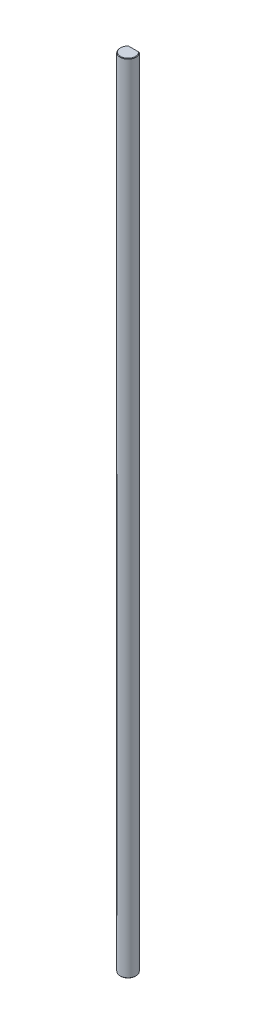
ISO-10303-21;
HEADER;
FILE_DESCRIPTION(('STEP AP214'),'2;1');
FILE_NAME('part.step','',(''),(''),'','','');
FILE_SCHEMA(('AUTOMOTIVE_DESIGN { 1 0 10303 214 1 1 1 1 }'));
ENDSEC;
DATA;
#1=APPLICATION_CONTEXT('core data for automotive mechanical design processes');
#2=APPLICATION_PROTOCOL_DEFINITION('international standard','automotive_design',2000,#1);
#3=PRODUCT_CONTEXT('',#1,'mechanical');
#4=PRODUCT('Part','Part','',(#3));
#5=PRODUCT_RELATED_PRODUCT_CATEGORY('part','',(#4));
#6=PRODUCT_DEFINITION_FORMATION('','',#4);
#7=PRODUCT_DEFINITION_CONTEXT('part definition',#1,'design');
#8=PRODUCT_DEFINITION('design','',#6,#7);
#9=PRODUCT_DEFINITION_SHAPE('','',#8);
#10=(LENGTH_UNIT() NAMED_UNIT(*) SI_UNIT(.MILLI.,.METRE.));
#11=(NAMED_UNIT(*) PLANE_ANGLE_UNIT() SI_UNIT($,.RADIAN.));
#12=(NAMED_UNIT(*) SI_UNIT($,.STERADIAN.) SOLID_ANGLE_UNIT());
#13=UNCERTAINTY_MEASURE_WITH_UNIT(LENGTH_MEASURE(1.E-05),#10,'distance_accuracy_value','');
#14=(GEOMETRIC_REPRESENTATION_CONTEXT(3) GLOBAL_UNCERTAINTY_ASSIGNED_CONTEXT((#13)) GLOBAL_UNIT_ASSIGNED_CONTEXT((#10,
#11,#12)) REPRESENTATION_CONTEXT('',''));
#15=CARTESIAN_POINT('',(0.,0.,0.));
#16=DIRECTION('',(0.,0.,1.));
#17=DIRECTION('',(1.,0.,0.));
#18=AXIS2_PLACEMENT_3D('',#15,#16,#17);
#19=CARTESIAN_POINT('',(0.,400.,0.));
#20=DIRECTION('',(0.,-1.,0.));
#21=DIRECTION('',(0.,0.,-1.));
#22=AXIS2_PLACEMENT_3D('',#19,#20,#21);
#23=CYLINDRICAL_SURFACE('',#22,4.);
#24=DIRECTION('',(0.,-1.,0.));
#25=VECTOR('',#24,1.);
#26=CARTESIAN_POINT('',(-2.64575131106459,400.,-3.));
#27=LINE('',#26,#25);
#28=CARTESIAN_POINT('',(-2.64575131106459,399.75,-3.));
#29=VERTEX_POINT('',#28);
#30=CARTESIAN_POINT('',(-2.64575131106459,0.250000000000028,-3.));
#31=VERTEX_POINT('',#30);
#32=EDGE_CURVE('E107',#29,#31,#27,.T.);
#33=ORIENTED_EDGE('',*,*,#32,.T.);
#34=CARTESIAN_POINT('',(0.,0.250000000000028,0.));
#35=DIRECTION('',(0.,1.,0.));
#36=DIRECTION('',(0.,0.,1.));
#37=AXIS2_PLACEMENT_3D('',#34,#35,#36);
#38=CIRCLE('',#37,4.);
#39=CARTESIAN_POINT('',(2.64575131106459,0.250000000000028,-3.));
#40=VERTEX_POINT('',#39);
#41=EDGE_CURVE('E123',#31,#40,#38,.T.);
#42=ORIENTED_EDGE('',*,*,#41,.T.);
#43=DIRECTION('',(0.,-1.,0.));
#44=VECTOR('',#43,1.);
#45=CARTESIAN_POINT('',(2.64575131106459,400.,-3.));
#46=LINE('',#45,#44);
#47=CARTESIAN_POINT('',(2.64575131106459,399.75,-3.));
#48=VERTEX_POINT('',#47);
#49=EDGE_CURVE('E166',#40,#48,#46,.F.);
#50=ORIENTED_EDGE('',*,*,#49,.T.);
#51=CARTESIAN_POINT('',(0.,399.75,0.));
#52=DIRECTION('',(0.,1.,0.));
#53=DIRECTION('',(0.,0.,1.));
#54=AXIS2_PLACEMENT_3D('',#51,#52,#53);
#55=CIRCLE('',#54,4.);
#56=EDGE_CURVE('E120',#48,#29,#55,.F.);
#57=ORIENTED_EDGE('',*,*,#56,.T.);
#58=EDGE_LOOP('',(#33,#42,#50,#57));
#59=FACE_BOUND('',#58,.T.);
#60=ADVANCED_FACE('F41',(#59),#23,.T.);
#61=CARTESIAN_POINT('',(0.,400.,0.));
#62=DIRECTION('',(0.,1.,0.));
#63=DIRECTION('',(0.,0.,1.));
#64=AXIS2_PLACEMENT_3D('',#61,#62,#63);
#65=PLANE('',#64);
#66=CARTESIAN_POINT('',(0.,400.,0.));
#67=DIRECTION('',(0.,1.,0.));
#68=DIRECTION('',(0.,0.,1.));
#69=AXIS2_PLACEMENT_3D('',#66,#67,#68);
#70=CIRCLE('',#69,3.75000000000009);
#71=CARTESIAN_POINT('',(-2.54950975679643,400.,-2.75000000000008));
#72=VERTEX_POINT('',#71);
#73=CARTESIAN_POINT('',(2.54950975679643,400.,-2.75000000000008));
#74=VERTEX_POINT('',#73);
#75=EDGE_CURVE('E57',#72,#74,#70,.T.);
#76=ORIENTED_EDGE('',*,*,#75,.T.);
#77=DIRECTION('',(-1.,0.,0.));
#78=VECTOR('',#77,1.);
#79=CARTESIAN_POINT('',(-2.64575131106459,400.,-2.75000000000009));
#80=LINE('',#79,#78);
#81=EDGE_CURVE('E11',#74,#72,#80,.T.);
#82=ORIENTED_EDGE('',*,*,#81,.T.);
#83=EDGE_LOOP('',(#76,#82));
#84=FACE_BOUND('',#83,.T.);
#85=ADVANCED_FACE('F180',(#84),#65,.T.);
#86=CARTESIAN_POINT('',(0.,0.,0.));
#87=DIRECTION('',(0.,1.,0.));
#88=DIRECTION('',(0.,0.,1.));
#89=AXIS2_PLACEMENT_3D('',#86,#87,#88);
#90=PLANE('',#89);
#91=CARTESIAN_POINT('',(0.,0.,0.));
#92=DIRECTION('',(0.,1.,0.));
#93=DIRECTION('',(0.,0.,1.));
#94=AXIS2_PLACEMENT_3D('',#91,#92,#93);
#95=CIRCLE('',#94,3.75000000000003);
#96=CARTESIAN_POINT('',(2.54950975679641,0.,-2.75000000000002));
#97=VERTEX_POINT('',#96);
#98=CARTESIAN_POINT('',(-2.54950975679641,0.,-2.75000000000002));
#99=VERTEX_POINT('',#98);
#100=EDGE_CURVE('E103',#97,#99,#95,.F.);
#101=ORIENTED_EDGE('',*,*,#100,.T.);
#102=DIRECTION('',(1.,0.,0.));
#103=VECTOR('',#102,1.);
#104=CARTESIAN_POINT('',(0.,0.,-2.75000000000003));
#105=LINE('',#104,#103);
#106=EDGE_CURVE('E94',#99,#97,#105,.T.);
#107=ORIENTED_EDGE('',*,*,#106,.T.);
#108=EDGE_LOOP('',(#101,#107));
#109=FACE_BOUND('',#108,.T.);
#110=ADVANCED_FACE('F109',(#109),#90,.F.);
#111=CARTESIAN_POINT('',(-4.,0.,-3.));
#112=DIRECTION('',(0.,0.,1.));
#113=DIRECTION('',(1.,0.,0.));
#114=AXIS2_PLACEMENT_3D('',#111,#112,#113);
#115=PLANE('',#114);
#116=ORIENTED_EDGE('',*,*,#49,.F.);
#117=DIRECTION('',(-1.,0.,0.));
#118=VECTOR('',#117,1.);
#119=CARTESIAN_POINT('',(-4.,0.250000000000011,-3.));
#120=LINE('',#119,#118);
#121=EDGE_CURVE('E96',#40,#31,#120,.T.);
#122=ORIENTED_EDGE('',*,*,#121,.T.);
#123=ORIENTED_EDGE('',*,*,#32,.F.);
#124=DIRECTION('',(1.,0.,0.));
#125=VECTOR('',#124,1.);
#126=CARTESIAN_POINT('',(2.64575131106459,399.75,-3.));
#127=LINE('',#126,#125);
#128=EDGE_CURVE('E111',#29,#48,#127,.T.);
#129=ORIENTED_EDGE('',*,*,#128,.T.);
#130=EDGE_LOOP('',(#116,#122,#123,#129));
#131=FACE_BOUND('',#130,.T.);
#132=ADVANCED_FACE('F175',(#131),#115,.F.);
#133=CARTESIAN_POINT('',(0.,0.250000000000028,0.));
#134=DIRECTION('',(0.,1.,0.));
#135=DIRECTION('',(0.,0.,1.));
#136=AXIS2_PLACEMENT_3D('',#133,#134,#135);
#137=CONICAL_SURFACE('',#136,4.,0.78539816339733);
#138=CARTESIAN_POINT('',(2.54950975679642,0.,-2.75000000000003));
#139=CARTESIAN_POINT('',(2.56582664272053,0.0416134286202959,-2.79161342862032));
#140=CARTESIAN_POINT('',(2.58200521660594,0.0832534799717027,-2.83325347997172));
#141=CARTESIAN_POINT('',(2.61408573459699,0.16658681332397,-2.91658681332397));
#142=CARTESIAN_POINT('',(2.62998767880096,0.208280095305902,-2.9582800953059));
#143=CARTESIAN_POINT('',(2.64575131106459,0.250000000000015,-3.));
#144=B_SPLINE_CURVE_WITH_KNOTS('',3,(#138,#139,#140,#141,#142,#143),.UNSPECIFIED.,.F.,.F.,(4,2,
4),(0.,0.183209732423114,0.366419399714003),.UNSPECIFIED.);
#145=EDGE_CURVE('E90',#40,#97,#144,.F.);
#146=ORIENTED_EDGE('',*,*,#145,.F.);
#147=ORIENTED_EDGE('',*,*,#41,.F.);
#148=CARTESIAN_POINT('',(-2.64575131106459,0.250000000000019,-3.));
#149=CARTESIAN_POINT('',(-2.62998767880096,0.208280095305904,-2.9582800953059));
#150=CARTESIAN_POINT('',(-2.61408573459699,0.166586813323971,-2.91658681332397));
#151=CARTESIAN_POINT('',(-2.58200521660595,0.0832534799717017,-2.83325347997172));
#152=CARTESIAN_POINT('',(-2.56582664272053,0.0416134286202946,-2.79161342862032));
#153=CARTESIAN_POINT('',(-2.54950975679642,0.,-2.75000000000003));
#154=B_SPLINE_CURVE_WITH_KNOTS('',3,(#148,#149,#150,#151,#152,#153),.UNSPECIFIED.,.F.,.F.,(4,2,
4),(0.,0.183209667290889,0.366419399714003),.UNSPECIFIED.);
#155=EDGE_CURVE('E100',#99,#31,#154,.F.);
#156=ORIENTED_EDGE('',*,*,#155,.F.);
#157=ORIENTED_EDGE('',*,*,#100,.F.);
#158=EDGE_LOOP('',(#146,#147,#156,#157));
#159=FACE_BOUND('',#158,.T.);
#160=ADVANCED_FACE('F104',(#159),#137,.T.);
#161=CARTESIAN_POINT('',(0.,0.,-2.75000000000003));
#162=DIRECTION('',(0.,0.707106781186489,0.707106781186607));
#163=DIRECTION('',(1.,0.,0.));
#164=AXIS2_PLACEMENT_3D('',#161,#162,#163);
#165=PLANE('',#164);
#166=ORIENTED_EDGE('',*,*,#155,.T.);
#167=ORIENTED_EDGE('',*,*,#121,.F.);
#168=ORIENTED_EDGE('',*,*,#145,.T.);
#169=ORIENTED_EDGE('',*,*,#106,.F.);
#170=EDGE_LOOP('',(#166,#167,#168,#169));
#171=FACE_BOUND('',#170,.T.);
#172=ADVANCED_FACE('F92',(#171),#165,.F.);
#173=CARTESIAN_POINT('',(0.,400.,0.));
#174=DIRECTION('',(0.,-1.,0.));
#175=DIRECTION('',(0.,0.,-1.));
#176=AXIS2_PLACEMENT_3D('',#173,#174,#175);
#177=CONICAL_SURFACE('',#176,3.75000000000009,0.78539816339733);
#178=CARTESIAN_POINT('',(2.64575131106459,399.75,-3.));
#179=CARTESIAN_POINT('',(2.62998767880097,399.791719904694,-2.9582800953059));
#180=CARTESIAN_POINT('',(2.61408573459701,399.833413186676,-2.91658681332398));
#181=CARTESIAN_POINT('',(2.58200521660597,399.916746520028,-2.83325347997174));
#182=CARTESIAN_POINT('',(2.56582664272055,399.95838657138,-2.79161342862036));
#183=CARTESIAN_POINT('',(2.54950975679644,400.,-2.75000000000008));
#184=B_SPLINE_CURVE_WITH_KNOTS('',3,(#178,#179,#180,#181,#182,#183),.UNSPECIFIED.,.F.,.F.,(4,2,
4),(0.,0.183209667290866,0.366419399713932),.UNSPECIFIED.);
#185=EDGE_CURVE('E155',#74,#48,#184,.F.);
#186=ORIENTED_EDGE('',*,*,#185,.F.);
#187=ORIENTED_EDGE('',*,*,#75,.F.);
#188=CARTESIAN_POINT('',(-2.54950975679644,400.,-2.75000000000009));
#189=CARTESIAN_POINT('',(-2.56582664272055,399.95838657138,-2.79161342862036));
#190=CARTESIAN_POINT('',(-2.58200521660596,399.916746520028,-2.83325347997175));
#191=CARTESIAN_POINT('',(-2.61408573459702,399.833413186676,-2.91658681332399));
#192=CARTESIAN_POINT('',(-2.62998767880099,399.791719904694,-2.95828009530591));
#193=CARTESIAN_POINT('',(-2.64575131106462,399.75,-3.00000000000001));
#194=B_SPLINE_CURVE_WITH_KNOTS('',3,(#188,#189,#190,#191,#192,#193),.UNSPECIFIED.,.F.,.F.,(4,2,
4),(0.,0.183209732423065,0.366419399713945),.UNSPECIFIED.);
#195=EDGE_CURVE('E47',#29,#72,#194,.F.);
#196=ORIENTED_EDGE('',*,*,#195,.F.);
#197=ORIENTED_EDGE('',*,*,#56,.F.);
#198=EDGE_LOOP('',(#186,#187,#196,#197));
#199=FACE_BOUND('',#198,.T.);
#200=ADVANCED_FACE('F146',(#199),#177,.T.);
#201=CARTESIAN_POINT('',(-4.,399.75,-3.));
#202=DIRECTION('',(0.,0.707106781186464,-0.707106781186631));
#203=DIRECTION('',(-1.,0.,0.));
#204=AXIS2_PLACEMENT_3D('',#201,#202,#203);
#205=PLANE('',#204);
#206=ORIENTED_EDGE('',*,*,#195,.T.);
#207=ORIENTED_EDGE('',*,*,#81,.F.);
#208=ORIENTED_EDGE('',*,*,#185,.T.);
#209=ORIENTED_EDGE('',*,*,#128,.F.);
#210=EDGE_LOOP('',(#206,#207,#208,#209));
#211=FACE_BOUND('',#210,.T.);
#212=ADVANCED_FACE('F44',(#211),#205,.T.);
#213=CLOSED_SHELL('',(#60,#85,#110,#132,#160,#172,#200,#212));
#214=MANIFOLD_SOLID_BREP('B2',#213);
#215=ADVANCED_BREP_SHAPE_REPRESENTATION('',(#18,#214),#14);
#216=SHAPE_DEFINITION_REPRESENTATION(#9,#215);
ENDSEC;
END-ISO-10303-21;
